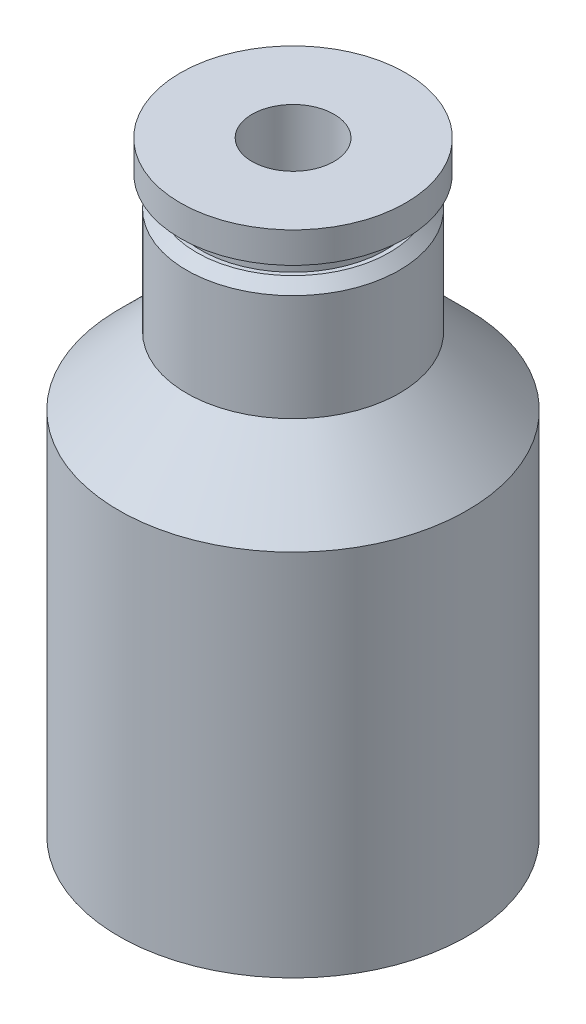
ISO-10303-21;
HEADER;
FILE_DESCRIPTION(('STEP AP214'),'2;1');
FILE_NAME('part.step','',(''),(''),'','','');
FILE_SCHEMA(('AUTOMOTIVE_DESIGN { 1 0 10303 214 1 1 1 1 }'));
ENDSEC;
DATA;
#1=APPLICATION_CONTEXT('core data for automotive mechanical design processes');
#2=APPLICATION_PROTOCOL_DEFINITION('international standard','automotive_design',2000,#1);
#3=PRODUCT_CONTEXT('',#1,'mechanical');
#4=PRODUCT('Part','Part','',(#3));
#5=PRODUCT_RELATED_PRODUCT_CATEGORY('part','',(#4));
#6=PRODUCT_DEFINITION_FORMATION('','',#4);
#7=PRODUCT_DEFINITION_CONTEXT('part definition',#1,'design');
#8=PRODUCT_DEFINITION('design','',#6,#7);
#9=PRODUCT_DEFINITION_SHAPE('','',#8);
#10=(LENGTH_UNIT() NAMED_UNIT(*) SI_UNIT(.MILLI.,.METRE.));
#11=(NAMED_UNIT(*) PLANE_ANGLE_UNIT() SI_UNIT($,.RADIAN.));
#12=(NAMED_UNIT(*) SI_UNIT($,.STERADIAN.) SOLID_ANGLE_UNIT());
#13=UNCERTAINTY_MEASURE_WITH_UNIT(LENGTH_MEASURE(1.E-05),#10,'distance_accuracy_value','');
#14=(GEOMETRIC_REPRESENTATION_CONTEXT(3) GLOBAL_UNCERTAINTY_ASSIGNED_CONTEXT((#13)) GLOBAL_UNIT_ASSIGNED_CONTEXT((#10,
#11,#12)) REPRESENTATION_CONTEXT('',''));
#15=CARTESIAN_POINT('',(0.,0.,0.));
#16=DIRECTION('',(0.,0.,1.));
#17=DIRECTION('',(1.,0.,0.));
#18=AXIS2_PLACEMENT_3D('',#15,#16,#17);
#19=CARTESIAN_POINT('',(2.,29.5,0.));
#20=DIRECTION('',(0.,1.,0.));
#21=DIRECTION('',(0.,0.,1.));
#22=AXIS2_PLACEMENT_3D('',#19,#20,#21);
#23=PLANE('',#22);
#24=CARTESIAN_POINT('',(0.,29.5,0.));
#25=DIRECTION('',(0.,-1.,0.));
#26=DIRECTION('',(0.,0.,-1.));
#27=AXIS2_PLACEMENT_3D('',#24,#25,#26);
#28=CIRCLE('',#27,2.);
#29=CARTESIAN_POINT('',(0.,29.5,-2.));
#30=VERTEX_POINT('',#29);
#31=EDGE_CURVE('E79',#30,#30,#28,.T.);
#32=ORIENTED_EDGE('',*,*,#31,.T.);
#33=EDGE_LOOP('',(#32));
#34=FACE_BOUND('',#33,.T.);
#35=CARTESIAN_POINT('',(0.,29.5,0.));
#36=DIRECTION('',(0.,-1.,0.));
#37=DIRECTION('',(0.,0.,-1.));
#38=AXIS2_PLACEMENT_3D('',#35,#36,#37);
#39=CIRCLE('',#38,5.5);
#40=CARTESIAN_POINT('',(0.,29.5,-5.5));
#41=VERTEX_POINT('',#40);
#42=EDGE_CURVE('E10',#41,#41,#39,.T.);
#43=ORIENTED_EDGE('',*,*,#42,.F.);
#44=EDGE_LOOP('',(#43));
#45=FACE_BOUND('',#44,.T.);
#46=ADVANCED_FACE('F36',(#34,#45),#23,.T.);
#47=CARTESIAN_POINT('',(0.,0.,0.));
#48=DIRECTION('',(0.,-1.,0.));
#49=DIRECTION('',(0.,0.,-1.));
#50=AXIS2_PLACEMENT_3D('',#47,#48,#49);
#51=CYLINDRICAL_SURFACE('',#50,5.5);
#52=ORIENTED_EDGE('',*,*,#42,.T.);
#53=EDGE_LOOP('',(#52));
#54=FACE_BOUND('',#53,.T.);
#55=CARTESIAN_POINT('',(0.,28.,0.));
#56=DIRECTION('',(0.,-1.,0.));
#57=DIRECTION('',(0.,0.,-1.));
#58=AXIS2_PLACEMENT_3D('',#55,#56,#57);
#59=CIRCLE('',#58,5.5);
#60=CARTESIAN_POINT('',(0.,28.,-5.5));
#61=VERTEX_POINT('',#60);
#62=EDGE_CURVE('E42',#61,#61,#59,.T.);
#63=ORIENTED_EDGE('',*,*,#62,.F.);
#64=EDGE_LOOP('',(#63));
#65=FACE_BOUND('',#64,.T.);
#66=ADVANCED_FACE('F97',(#54,#65),#51,.T.);
#67=CARTESIAN_POINT('',(5.5,28.,0.));
#68=DIRECTION('',(0.,-1.,0.));
#69=DIRECTION('',(0.,0.,-1.));
#70=AXIS2_PLACEMENT_3D('',#67,#68,#69);
#71=PLANE('',#70);
#72=ORIENTED_EDGE('',*,*,#62,.T.);
#73=EDGE_LOOP('',(#72));
#74=FACE_BOUND('',#73,.T.);
#75=CARTESIAN_POINT('',(0.,28.,0.));
#76=DIRECTION('',(0.,-1.,0.));
#77=DIRECTION('',(0.,0.,-1.));
#78=AXIS2_PLACEMENT_3D('',#75,#76,#77);
#79=CIRCLE('',#78,4.5);
#80=CARTESIAN_POINT('',(0.,28.,-4.5));
#81=VERTEX_POINT('',#80);
#82=EDGE_CURVE('E46',#81,#81,#79,.T.);
#83=ORIENTED_EDGE('',*,*,#82,.F.);
#84=EDGE_LOOP('',(#83));
#85=FACE_BOUND('',#84,.T.);
#86=ADVANCED_FACE('F101',(#74,#85),#71,.T.);
#87=CARTESIAN_POINT('',(0.,0.,0.));
#88=DIRECTION('',(0.,-1.,0.));
#89=DIRECTION('',(0.,0.,-1.));
#90=AXIS2_PLACEMENT_3D('',#87,#88,#89);
#91=CYLINDRICAL_SURFACE('',#90,4.5);
#92=ORIENTED_EDGE('',*,*,#82,.T.);
#93=EDGE_LOOP('',(#92));
#94=FACE_BOUND('',#93,.T.);
#95=CARTESIAN_POINT('',(0.,27.,0.));
#96=DIRECTION('',(0.,-1.,0.));
#97=DIRECTION('',(0.,0.,-1.));
#98=AXIS2_PLACEMENT_3D('',#95,#96,#97);
#99=CIRCLE('',#98,4.5);
#100=CARTESIAN_POINT('',(0.,27.,-4.5));
#101=VERTEX_POINT('',#100);
#102=EDGE_CURVE('E50',#101,#101,#99,.T.);
#103=ORIENTED_EDGE('',*,*,#102,.F.);
#104=EDGE_LOOP('',(#103));
#105=FACE_BOUND('',#104,.T.);
#106=ADVANCED_FACE('F105',(#94,#105),#91,.T.);
#107=CARTESIAN_POINT('',(4.5,27.,0.));
#108=DIRECTION('',(0.,1.,0.));
#109=DIRECTION('',(0.,0.,1.));
#110=AXIS2_PLACEMENT_3D('',#107,#108,#109);
#111=PLANE('',#110);
#112=ORIENTED_EDGE('',*,*,#102,.T.);
#113=EDGE_LOOP('',(#112));
#114=FACE_BOUND('',#113,.T.);
#115=CARTESIAN_POINT('',(0.,27.,0.));
#116=DIRECTION('',(0.,-1.,0.));
#117=DIRECTION('',(0.,0.,-1.));
#118=AXIS2_PLACEMENT_3D('',#115,#116,#117);
#119=CIRCLE('',#118,4.7);
#120=CARTESIAN_POINT('',(0.,27.,-4.7));
#121=VERTEX_POINT('',#120);
#122=EDGE_CURVE('E55',#121,#121,#119,.T.);
#123=ORIENTED_EDGE('',*,*,#122,.F.);
#124=EDGE_LOOP('',(#123));
#125=FACE_BOUND('',#124,.T.);
#126=ADVANCED_FACE('F111',(#114,#125),#111,.T.);
#127=CARTESIAN_POINT('',(0.,26.5038475772934,0.));
#128=DIRECTION('',(0.,-1.,0.));
#129=DIRECTION('',(0.,0.,-1.));
#130=AXIS2_PLACEMENT_3D('',#127,#128,#129);
#131=CONICAL_SURFACE('',#130,5.19615242270664,0.785398163397452);
#132=ORIENTED_EDGE('',*,*,#122,.T.);
#133=EDGE_LOOP('',(#132));
#134=FACE_BOUND('',#133,.T.);
#135=CARTESIAN_POINT('',(0.,26.5038475772934,0.));
#136=DIRECTION('',(0.,-1.,0.));
#137=DIRECTION('',(0.,0.,-1.));
#138=AXIS2_PLACEMENT_3D('',#135,#136,#137);
#139=CIRCLE('',#138,5.19615242270664);
#140=CARTESIAN_POINT('',(0.,26.5038475772934,-5.19615242270664));
#141=VERTEX_POINT('',#140);
#142=EDGE_CURVE('E58',#141,#141,#139,.T.);
#143=ORIENTED_EDGE('',*,*,#142,.F.);
#144=EDGE_LOOP('',(#143));
#145=FACE_BOUND('',#144,.T.);
#146=ADVANCED_FACE('F115',(#134,#145),#131,.T.);
#147=CARTESIAN_POINT('',(0.,0.,0.));
#148=DIRECTION('',(0.,-1.,0.));
#149=DIRECTION('',(0.,0.,-1.));
#150=AXIS2_PLACEMENT_3D('',#147,#148,#149);
#151=CYLINDRICAL_SURFACE('',#150,5.19615242270664);
#152=ORIENTED_EDGE('',*,*,#142,.T.);
#153=EDGE_LOOP('',(#152));
#154=FACE_BOUND('',#153,.T.);
#155=CARTESIAN_POINT('',(0.,21.3038475772934,0.));
#156=DIRECTION('',(0.,-1.,0.));
#157=DIRECTION('',(0.,0.,-1.));
#158=AXIS2_PLACEMENT_3D('',#155,#156,#157);
#159=CIRCLE('',#158,5.19615242270664);
#160=CARTESIAN_POINT('',(0.,21.3038475772934,-5.19615242270664));
#161=VERTEX_POINT('',#160);
#162=EDGE_CURVE('E61',#161,#161,#159,.T.);
#163=ORIENTED_EDGE('',*,*,#162,.F.);
#164=EDGE_LOOP('',(#163));
#165=FACE_BOUND('',#164,.T.);
#166=ADVANCED_FACE('F119',(#154,#165),#151,.T.);
#167=CARTESIAN_POINT('',(0.,18.,0.));
#168=DIRECTION('',(0.,-1.,0.));
#169=DIRECTION('',(0.,0.,-1.));
#170=AXIS2_PLACEMENT_3D('',#167,#168,#169);
#171=CONICAL_SURFACE('',#170,8.5,0.785398163397447);
#172=ORIENTED_EDGE('',*,*,#162,.T.);
#173=EDGE_LOOP('',(#172));
#174=FACE_BOUND('',#173,.T.);
#175=CARTESIAN_POINT('',(0.,18.,0.));
#176=DIRECTION('',(0.,-1.,0.));
#177=DIRECTION('',(0.,0.,-1.));
#178=AXIS2_PLACEMENT_3D('',#175,#176,#177);
#179=CIRCLE('',#178,8.5);
#180=CARTESIAN_POINT('',(0.,18.,-8.5));
#181=VERTEX_POINT('',#180);
#182=EDGE_CURVE('E64',#181,#181,#179,.T.);
#183=ORIENTED_EDGE('',*,*,#182,.F.);
#184=EDGE_LOOP('',(#183));
#185=FACE_BOUND('',#184,.T.);
#186=ADVANCED_FACE('F123',(#174,#185),#171,.T.);
#187=CARTESIAN_POINT('',(0.,0.,0.));
#188=DIRECTION('',(0.,-1.,0.));
#189=DIRECTION('',(0.,0.,-1.));
#190=AXIS2_PLACEMENT_3D('',#187,#188,#189);
#191=CYLINDRICAL_SURFACE('',#190,8.5);
#192=ORIENTED_EDGE('',*,*,#182,.T.);
#193=EDGE_LOOP('',(#192));
#194=FACE_BOUND('',#193,.T.);
#195=CARTESIAN_POINT('',(0.,0.,0.));
#196=DIRECTION('',(0.,-1.,0.));
#197=DIRECTION('',(0.,0.,-1.));
#198=AXIS2_PLACEMENT_3D('',#195,#196,#197);
#199=CIRCLE('',#198,8.5);
#200=CARTESIAN_POINT('',(0.,0.,-8.5));
#201=VERTEX_POINT('',#200);
#202=EDGE_CURVE('E67',#201,#201,#199,.T.);
#203=ORIENTED_EDGE('',*,*,#202,.F.);
#204=EDGE_LOOP('',(#203));
#205=FACE_BOUND('',#204,.T.);
#206=ADVANCED_FACE('F127',(#194,#205),#191,.T.);
#207=CARTESIAN_POINT('',(8.5,0.,0.));
#208=DIRECTION('',(0.,-1.,0.));
#209=DIRECTION('',(0.,0.,-1.));
#210=AXIS2_PLACEMENT_3D('',#207,#208,#209);
#211=PLANE('',#210);
#212=ORIENTED_EDGE('',*,*,#202,.T.);
#213=EDGE_LOOP('',(#212));
#214=FACE_BOUND('',#213,.T.);
#215=CARTESIAN_POINT('',(0.,0.,0.));
#216=DIRECTION('',(0.,-1.,0.));
#217=DIRECTION('',(0.,0.,-1.));
#218=AXIS2_PLACEMENT_3D('',#215,#216,#217);
#219=CIRCLE('',#218,6.);
#220=CARTESIAN_POINT('',(0.,0.,-6.));
#221=VERTEX_POINT('',#220);
#222=EDGE_CURVE('E70',#221,#221,#219,.T.);
#223=ORIENTED_EDGE('',*,*,#222,.F.);
#224=EDGE_LOOP('',(#223));
#225=FACE_BOUND('',#224,.T.);
#226=ADVANCED_FACE('F131',(#214,#225),#211,.T.);
#227=CARTESIAN_POINT('',(0.,0.,0.));
#228=DIRECTION('',(0.,-1.,0.));
#229=DIRECTION('',(0.,0.,-1.));
#230=AXIS2_PLACEMENT_3D('',#227,#228,#229);
#231=CYLINDRICAL_SURFACE('',#230,6.);
#232=ORIENTED_EDGE('',*,*,#222,.T.);
#233=EDGE_LOOP('',(#232));
#234=FACE_BOUND('',#233,.T.);
#235=CARTESIAN_POINT('',(0.,10.,0.));
#236=DIRECTION('',(0.,-1.,0.));
#237=DIRECTION('',(0.,0.,-1.));
#238=AXIS2_PLACEMENT_3D('',#235,#236,#237);
#239=CIRCLE('',#238,6.);
#240=CARTESIAN_POINT('',(0.,10.,-6.));
#241=VERTEX_POINT('',#240);
#242=EDGE_CURVE('E73',#241,#241,#239,.T.);
#243=ORIENTED_EDGE('',*,*,#242,.F.);
#244=EDGE_LOOP('',(#243));
#245=FACE_BOUND('',#244,.T.);
#246=ADVANCED_FACE('F93',(#234,#245),#231,.F.);
#247=CARTESIAN_POINT('',(6.,10.,0.));
#248=DIRECTION('',(0.,-1.,0.));
#249=DIRECTION('',(0.,0.,-1.));
#250=AXIS2_PLACEMENT_3D('',#247,#248,#249);
#251=PLANE('',#250);
#252=ORIENTED_EDGE('',*,*,#242,.T.);
#253=EDGE_LOOP('',(#252));
#254=FACE_BOUND('',#253,.T.);
#255=CARTESIAN_POINT('',(0.,10.,0.));
#256=DIRECTION('',(0.,-1.,0.));
#257=DIRECTION('',(0.,0.,-1.));
#258=AXIS2_PLACEMENT_3D('',#255,#256,#257);
#259=CIRCLE('',#258,2.);
#260=CARTESIAN_POINT('',(0.,10.,-2.));
#261=VERTEX_POINT('',#260);
#262=EDGE_CURVE('E76',#261,#261,#259,.T.);
#263=ORIENTED_EDGE('',*,*,#262,.F.);
#264=EDGE_LOOP('',(#263));
#265=FACE_BOUND('',#264,.T.);
#266=ADVANCED_FACE('F87',(#254,#265),#251,.T.);
#267=CARTESIAN_POINT('',(0.,0.,0.));
#268=DIRECTION('',(0.,-1.,0.));
#269=DIRECTION('',(0.,0.,-1.));
#270=AXIS2_PLACEMENT_3D('',#267,#268,#269);
#271=CYLINDRICAL_SURFACE('',#270,2.);
#272=ORIENTED_EDGE('',*,*,#262,.T.);
#273=EDGE_LOOP('',(#272));
#274=FACE_BOUND('',#273,.T.);
#275=ORIENTED_EDGE('',*,*,#31,.F.);
#276=EDGE_LOOP('',(#275));
#277=FACE_BOUND('',#276,.T.);
#278=ADVANCED_FACE('F85',(#274,#277),#271,.F.);
#279=CLOSED_SHELL('',(#46,#66,#86,#106,#126,#146,#166,#186,#206,#226,#246,#266,#278));
#280=MANIFOLD_SOLID_BREP('B2',#279);
#281=ADVANCED_BREP_SHAPE_REPRESENTATION('',(#18,#280),#14);
#282=SHAPE_DEFINITION_REPRESENTATION(#9,#281);
ENDSEC;
END-ISO-10303-21;
